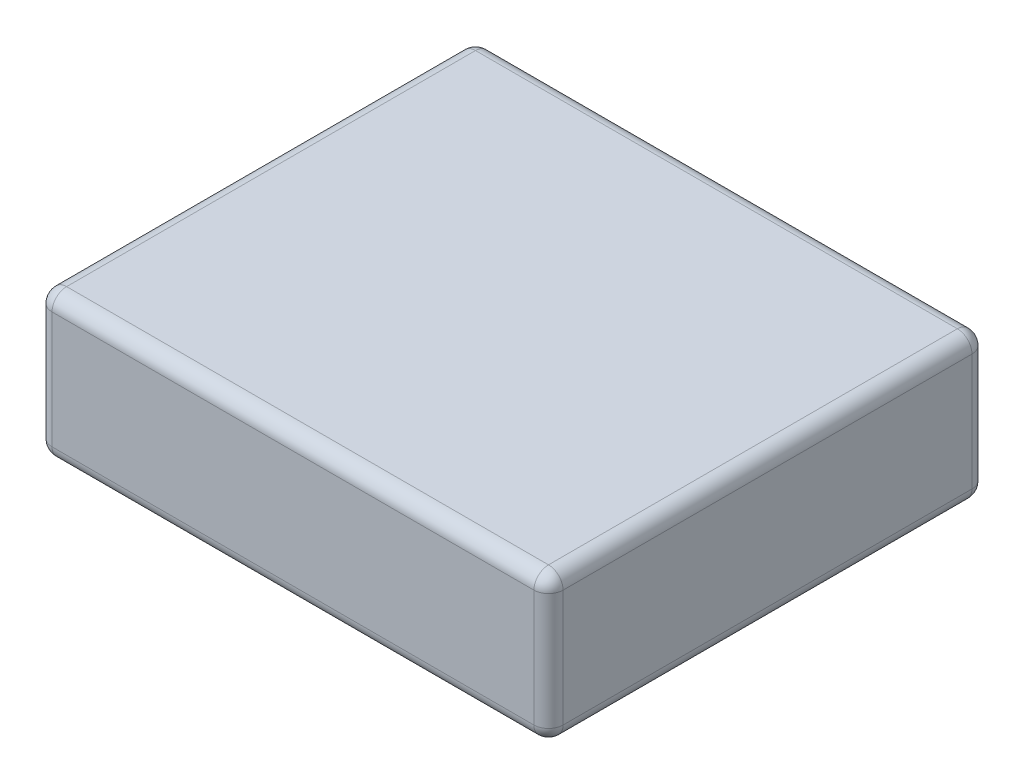
ISO-10303-21;
HEADER;
FILE_DESCRIPTION(('STEP AP214'),'2;1');
FILE_NAME('part.step','',(''),(''),'','','');
FILE_SCHEMA(('AUTOMOTIVE_DESIGN { 1 0 10303 214 1 1 1 1 }'));
ENDSEC;
DATA;
#1=APPLICATION_CONTEXT('core data for automotive mechanical design processes');
#2=APPLICATION_PROTOCOL_DEFINITION('international standard','automotive_design',2000,#1);
#3=PRODUCT_CONTEXT('',#1,'mechanical');
#4=PRODUCT('Part','Part','',(#3));
#5=PRODUCT_RELATED_PRODUCT_CATEGORY('part','',(#4));
#6=PRODUCT_DEFINITION_FORMATION('','',#4);
#7=PRODUCT_DEFINITION_CONTEXT('part definition',#1,'design');
#8=PRODUCT_DEFINITION('design','',#6,#7);
#9=PRODUCT_DEFINITION_SHAPE('','',#8);
#10=(LENGTH_UNIT() NAMED_UNIT(*) SI_UNIT(.MILLI.,.METRE.));
#11=(NAMED_UNIT(*) PLANE_ANGLE_UNIT() SI_UNIT($,.RADIAN.));
#12=(NAMED_UNIT(*) SI_UNIT($,.STERADIAN.) SOLID_ANGLE_UNIT());
#13=UNCERTAINTY_MEASURE_WITH_UNIT(LENGTH_MEASURE(1.E-05),#10,'distance_accuracy_value','');
#14=(GEOMETRIC_REPRESENTATION_CONTEXT(3) GLOBAL_UNCERTAINTY_ASSIGNED_CONTEXT((#13)) GLOBAL_UNIT_ASSIGNED_CONTEXT((#10,
#11,#12)) REPRESENTATION_CONTEXT('',''));
#15=CARTESIAN_POINT('',(0.,0.,0.));
#16=DIRECTION('',(0.,0.,1.));
#17=DIRECTION('',(1.,0.,0.));
#18=AXIS2_PLACEMENT_3D('',#15,#16,#17);
#19=CARTESIAN_POINT('',(36.6442953020134,4.84899328859059,60.));
#20=DIRECTION('',(-1.,0.,0.));
#21=DIRECTION('',(0.,0.,1.));
#22=AXIS2_PLACEMENT_3D('',#19,#20,#21);
#23=PLANE('',#22);
#24=DIRECTION('',(0.,0.,-1.));
#25=VECTOR('',#24,1.);
#26=CARTESIAN_POINT('',(36.6442953020134,-13.1510067114094,60.));
#27=LINE('',#26,#25);
#28=CARTESIAN_POINT('',(36.6442953020134,-13.1510067114094,58.));
#29=VERTEX_POINT('',#28);
#30=CARTESIAN_POINT('',(36.6442953020134,-13.1510067114094,2.));
#31=VERTEX_POINT('',#30);
#32=EDGE_CURVE('E225',#29,#31,#27,.T.);
#33=ORIENTED_EDGE('',*,*,#32,.T.);
#34=DIRECTION('',(0.,1.,0.));
#35=VECTOR('',#34,1.);
#36=CARTESIAN_POINT('',(36.6442953020134,4.84899328859059,2.));
#37=LINE('',#36,#35);
#38=CARTESIAN_POINT('',(36.6442953020134,2.84899328859059,2.));
#39=VERTEX_POINT('',#38);
#40=EDGE_CURVE('E229',#31,#39,#37,.T.);
#41=ORIENTED_EDGE('',*,*,#40,.T.);
#42=DIRECTION('',(0.,0.,-1.));
#43=VECTOR('',#42,1.);
#44=CARTESIAN_POINT('',(36.6442953020134,2.84899328859059,60.));
#45=LINE('',#44,#43);
#46=CARTESIAN_POINT('',(36.6442953020134,2.84899328859059,58.));
#47=VERTEX_POINT('',#46);
#48=EDGE_CURVE('E222',#39,#47,#45,.F.);
#49=ORIENTED_EDGE('',*,*,#48,.T.);
#50=DIRECTION('',(0.,1.,0.));
#51=VECTOR('',#50,1.);
#52=CARTESIAN_POINT('',(36.6442953020134,-15.1510067114094,58.));
#53=LINE('',#52,#51);
#54=EDGE_CURVE('E219',#47,#29,#53,.F.);
#55=ORIENTED_EDGE('',*,*,#54,.T.);
#56=EDGE_LOOP('',(#33,#41,#49,#55));
#57=FACE_BOUND('',#56,.T.);
#58=ADVANCED_FACE('F43',(#57),#23,.F.);
#59=CARTESIAN_POINT('',(-33.3557046979866,4.84899328859059,60.));
#60=DIRECTION('',(0.,-1.,0.));
#61=DIRECTION('',(0.,0.,-1.));
#62=AXIS2_PLACEMENT_3D('',#59,#60,#61);
#63=PLANE('',#62);
#64=DIRECTION('',(-1.,0.,0.));
#65=VECTOR('',#64,1.);
#66=CARTESIAN_POINT('',(-33.3557046979866,4.84899328859059,2.));
#67=LINE('',#66,#65);
#68=CARTESIAN_POINT('',(34.6442953020134,4.84899328859059,2.));
#69=VERTEX_POINT('',#68);
#70=CARTESIAN_POINT('',(-31.3557046979866,4.84899328859059,2.));
#71=VERTEX_POINT('',#70);
#72=EDGE_CURVE('E188',#69,#71,#67,.T.);
#73=ORIENTED_EDGE('',*,*,#72,.T.);
#74=DIRECTION('',(0.,0.,-1.));
#75=VECTOR('',#74,1.);
#76=CARTESIAN_POINT('',(-31.3557046979866,4.84899328859059,60.));
#77=LINE('',#76,#75);
#78=CARTESIAN_POINT('',(-31.3557046979866,4.84899328859059,58.));
#79=VERTEX_POINT('',#78);
#80=EDGE_CURVE('E191',#71,#79,#77,.F.);
#81=ORIENTED_EDGE('',*,*,#80,.T.);
#82=DIRECTION('',(-1.,0.,0.));
#83=VECTOR('',#82,1.);
#84=CARTESIAN_POINT('',(36.6442953020134,4.84899328859059,58.));
#85=LINE('',#84,#83);
#86=CARTESIAN_POINT('',(34.6442953020134,4.84899328859059,58.));
#87=VERTEX_POINT('',#86);
#88=EDGE_CURVE('E182',#79,#87,#85,.F.);
#89=ORIENTED_EDGE('',*,*,#88,.T.);
#90=DIRECTION('',(0.,0.,-1.));
#91=VECTOR('',#90,1.);
#92=CARTESIAN_POINT('',(34.6442953020134,4.84899328859059,60.));
#93=LINE('',#92,#91);
#94=EDGE_CURVE('E185',#87,#69,#93,.T.);
#95=ORIENTED_EDGE('',*,*,#94,.T.);
#96=EDGE_LOOP('',(#73,#81,#89,#95));
#97=FACE_BOUND('',#96,.T.);
#98=ADVANCED_FACE('F363',(#97),#63,.F.);
#99=CARTESIAN_POINT('',(-33.3557046979866,4.84899328859059,60.));
#100=DIRECTION('',(1.,0.,0.));
#101=DIRECTION('',(0.,1.,0.));
#102=AXIS2_PLACEMENT_3D('',#99,#100,#101);
#103=PLANE('',#102);
#104=DIRECTION('',(0.,0.,-1.));
#105=VECTOR('',#104,1.);
#106=CARTESIAN_POINT('',(-33.3557046979866,2.84899328859059,60.));
#107=LINE('',#106,#105);
#108=CARTESIAN_POINT('',(-33.3557046979866,2.84899328859059,58.));
#109=VERTEX_POINT('',#108);
#110=CARTESIAN_POINT('',(-33.3557046979866,2.84899328859059,2.));
#111=VERTEX_POINT('',#110);
#112=EDGE_CURVE('E144',#109,#111,#107,.T.);
#113=ORIENTED_EDGE('',*,*,#112,.T.);
#114=DIRECTION('',(0.,-1.,0.));
#115=VECTOR('',#114,1.);
#116=CARTESIAN_POINT('',(-33.3557046979866,4.84899328859059,2.));
#117=LINE('',#116,#115);
#118=CARTESIAN_POINT('',(-33.3557046979866,-13.1510067114094,2.));
#119=VERTEX_POINT('',#118);
#120=EDGE_CURVE('E139',#111,#119,#117,.T.);
#121=ORIENTED_EDGE('',*,*,#120,.T.);
#122=DIRECTION('',(0.,0.,-1.));
#123=VECTOR('',#122,1.);
#124=CARTESIAN_POINT('',(-33.3557046979866,-13.1510067114094,60.));
#125=LINE('',#124,#123);
#126=CARTESIAN_POINT('',(-33.3557046979866,-13.1510067114094,58.));
#127=VERTEX_POINT('',#126);
#128=EDGE_CURVE('E131',#119,#127,#125,.F.);
#129=ORIENTED_EDGE('',*,*,#128,.T.);
#130=DIRECTION('',(0.,-1.,0.));
#131=VECTOR('',#130,1.);
#132=CARTESIAN_POINT('',(-33.3557046979866,4.84899328859059,58.));
#133=LINE('',#132,#131);
#134=EDGE_CURVE('E136',#127,#109,#133,.F.);
#135=ORIENTED_EDGE('',*,*,#134,.T.);
#136=EDGE_LOOP('',(#113,#121,#129,#135));
#137=FACE_BOUND('',#136,.T.);
#138=ADVANCED_FACE('F134',(#137),#103,.F.);
#139=CARTESIAN_POINT('',(-33.3557046979866,-15.1510067114094,60.));
#140=DIRECTION('',(0.,1.,0.));
#141=DIRECTION('',(0.,0.,1.));
#142=AXIS2_PLACEMENT_3D('',#139,#140,#141);
#143=PLANE('',#142);
#144=DIRECTION('',(1.,0.,0.));
#145=VECTOR('',#144,1.);
#146=CARTESIAN_POINT('',(-33.3557046979866,-15.1510067114094,58.));
#147=LINE('',#146,#145);
#148=CARTESIAN_POINT('',(34.6442953020134,-15.1510067114094,58.));
#149=VERTEX_POINT('',#148);
#150=CARTESIAN_POINT('',(-31.3557046979866,-15.1510067114094,58.));
#151=VERTEX_POINT('',#150);
#152=EDGE_CURVE('E195',#149,#151,#147,.F.);
#153=ORIENTED_EDGE('',*,*,#152,.T.);
#154=DIRECTION('',(0.,0.,-1.));
#155=VECTOR('',#154,1.);
#156=CARTESIAN_POINT('',(-31.3557046979866,-15.1510067114094,60.));
#157=LINE('',#156,#155);
#158=CARTESIAN_POINT('',(-31.3557046979866,-15.1510067114094,2.));
#159=VERTEX_POINT('',#158);
#160=EDGE_CURVE('E152',#151,#159,#157,.T.);
#161=ORIENTED_EDGE('',*,*,#160,.T.);
#162=DIRECTION('',(1.,0.,0.));
#163=VECTOR('',#162,1.);
#164=CARTESIAN_POINT('',(-33.3557046979866,-15.1510067114094,2.));
#165=LINE('',#164,#163);
#166=CARTESIAN_POINT('',(34.6442953020134,-15.1510067114094,2.));
#167=VERTEX_POINT('',#166);
#168=EDGE_CURVE('E201',#159,#167,#165,.T.);
#169=ORIENTED_EDGE('',*,*,#168,.T.);
#170=DIRECTION('',(0.,0.,-1.));
#171=VECTOR('',#170,1.);
#172=CARTESIAN_POINT('',(34.6442953020134,-15.1510067114094,60.));
#173=LINE('',#172,#171);
#174=EDGE_CURVE('E198',#167,#149,#173,.F.);
#175=ORIENTED_EDGE('',*,*,#174,.T.);
#176=EDGE_LOOP('',(#153,#161,#169,#175));
#177=FACE_BOUND('',#176,.T.);
#178=ADVANCED_FACE('F354',(#177),#143,.F.);
#179=CARTESIAN_POINT('',(0.,0.,60.));
#180=DIRECTION('',(0.,0.,1.));
#181=DIRECTION('',(1.,0.,0.));
#182=AXIS2_PLACEMENT_3D('',#179,#180,#181);
#183=PLANE('',#182);
#184=DIRECTION('',(0.,-1.,0.));
#185=VECTOR('',#184,1.);
#186=CARTESIAN_POINT('',(-31.3557046979866,-15.1510067114094,60.));
#187=LINE('',#186,#185);
#188=CARTESIAN_POINT('',(-31.3557046979866,2.84899328859059,60.));
#189=VERTEX_POINT('',#188);
#190=CARTESIAN_POINT('',(-31.3557046979866,-13.1510067114094,60.));
#191=VERTEX_POINT('',#190);
#192=EDGE_CURVE('E53',#189,#191,#187,.T.);
#193=ORIENTED_EDGE('',*,*,#192,.T.);
#194=DIRECTION('',(1.,0.,0.));
#195=VECTOR('',#194,1.);
#196=CARTESIAN_POINT('',(36.6442953020134,-13.1510067114094,60.));
#197=LINE('',#196,#195);
#198=CARTESIAN_POINT('',(34.6442953020134,-13.1510067114094,60.));
#199=VERTEX_POINT('',#198);
#200=EDGE_CURVE('E11',#191,#199,#197,.T.);
#201=ORIENTED_EDGE('',*,*,#200,.T.);
#202=DIRECTION('',(0.,1.,0.));
#203=VECTOR('',#202,1.);
#204=CARTESIAN_POINT('',(34.6442953020134,4.84899328859059,60.));
#205=LINE('',#204,#203);
#206=CARTESIAN_POINT('',(34.6442953020134,2.84899328859059,60.));
#207=VERTEX_POINT('',#206);
#208=EDGE_CURVE('E232',#199,#207,#205,.T.);
#209=ORIENTED_EDGE('',*,*,#208,.T.);
#210=DIRECTION('',(-1.,0.,0.));
#211=VECTOR('',#210,1.);
#212=CARTESIAN_POINT('',(-33.3557046979866,2.84899328859059,60.));
#213=LINE('',#212,#211);
#214=EDGE_CURVE('E64',#207,#189,#213,.T.);
#215=ORIENTED_EDGE('',*,*,#214,.T.);
#216=EDGE_LOOP('',(#193,#201,#209,#215));
#217=FACE_BOUND('',#216,.T.);
#218=ADVANCED_FACE('F356',(#217),#183,.T.);
#219=CARTESIAN_POINT('',(0.,0.,0.));
#220=DIRECTION('',(0.,0.,1.));
#221=DIRECTION('',(1.,0.,0.));
#222=AXIS2_PLACEMENT_3D('',#219,#220,#221);
#223=PLANE('',#222);
#224=DIRECTION('',(0.,-1.,0.));
#225=VECTOR('',#224,1.);
#226=CARTESIAN_POINT('',(-31.3557046979866,0.,0.));
#227=LINE('',#226,#225);
#228=CARTESIAN_POINT('',(-31.3557046979866,-13.1510067114094,0.));
#229=VERTEX_POINT('',#228);
#230=CARTESIAN_POINT('',(-31.3557046979866,2.84899328859059,0.));
#231=VERTEX_POINT('',#230);
#232=EDGE_CURVE('E212',#229,#231,#227,.F.);
#233=ORIENTED_EDGE('',*,*,#232,.T.);
#234=DIRECTION('',(-1.,0.,0.));
#235=VECTOR('',#234,1.);
#236=CARTESIAN_POINT('',(0.,2.84899328859059,0.));
#237=LINE('',#236,#235);
#238=CARTESIAN_POINT('',(34.6442953020134,2.84899328859059,0.));
#239=VERTEX_POINT('',#238);
#240=EDGE_CURVE('E215',#231,#239,#237,.F.);
#241=ORIENTED_EDGE('',*,*,#240,.T.);
#242=DIRECTION('',(0.,1.,0.));
#243=VECTOR('',#242,1.);
#244=CARTESIAN_POINT('',(34.6442953020134,0.,0.));
#245=LINE('',#244,#243);
#246=CARTESIAN_POINT('',(34.6442953020134,-13.1510067114094,0.));
#247=VERTEX_POINT('',#246);
#248=EDGE_CURVE('E206',#239,#247,#245,.F.);
#249=ORIENTED_EDGE('',*,*,#248,.T.);
#250=DIRECTION('',(1.,0.,0.));
#251=VECTOR('',#250,1.);
#252=CARTESIAN_POINT('',(0.,-13.1510067114094,0.));
#253=LINE('',#252,#251);
#254=EDGE_CURVE('E209',#247,#229,#253,.F.);
#255=ORIENTED_EDGE('',*,*,#254,.T.);
#256=EDGE_LOOP('',(#233,#241,#249,#255));
#257=FACE_BOUND('',#256,.T.);
#258=ADVANCED_FACE('F323',(#257),#223,.F.);
#259=CARTESIAN_POINT('',(34.6442953020134,-13.1510067114094,60.));
#260=DIRECTION('',(0.,0.,-1.));
#261=DIRECTION('',(-1.,0.,0.));
#262=AXIS2_PLACEMENT_3D('',#259,#260,#261);
#263=CYLINDRICAL_SURFACE('',#262,2.);
#264=CARTESIAN_POINT('',(34.6442953020134,-13.1510067114094,58.));
#265=DIRECTION('',(0.,0.,1.));
#266=DIRECTION('',(1.,0.,0.));
#267=AXIS2_PLACEMENT_3D('',#264,#265,#266);
#268=CIRCLE('',#267,2.);
#269=EDGE_CURVE('E47',#149,#29,#268,.T.);
#270=ORIENTED_EDGE('',*,*,#269,.F.);
#271=ORIENTED_EDGE('',*,*,#174,.F.);
#272=CARTESIAN_POINT('',(34.6442953020134,-13.1510067114094,2.));
#273=DIRECTION('',(0.,0.,-1.));
#274=DIRECTION('',(-1.,0.,0.));
#275=AXIS2_PLACEMENT_3D('',#272,#273,#274);
#276=CIRCLE('',#275,2.);
#277=EDGE_CURVE('E176',#31,#167,#276,.T.);
#278=ORIENTED_EDGE('',*,*,#277,.F.);
#279=ORIENTED_EDGE('',*,*,#32,.F.);
#280=EDGE_LOOP('',(#270,#271,#278,#279));
#281=FACE_BOUND('',#280,.T.);
#282=ADVANCED_FACE('F45',(#281),#263,.T.);
#283=CARTESIAN_POINT('',(34.6442953020134,-13.1510067114094,58.));
#284=DIRECTION('',(1.,0.,0.));
#285=DIRECTION('',(0.,1.,0.));
#286=AXIS2_PLACEMENT_3D('',#283,#284,#285);
#287=SPHERICAL_SURFACE('',#286,2.);
#288=CARTESIAN_POINT('',(34.6442953020134,-13.1510067114094,58.));
#289=DIRECTION('',(1.,0.,0.));
#290=DIRECTION('',(0.,0.,-1.));
#291=AXIS2_PLACEMENT_3D('',#288,#289,#290);
#292=CIRCLE('',#291,2.);
#293=EDGE_CURVE('E299',#149,#199,#292,.F.);
#294=ORIENTED_EDGE('',*,*,#293,.F.);
#295=ORIENTED_EDGE('',*,*,#269,.T.);
#296=CARTESIAN_POINT('',(34.6442953020134,-13.1510067114094,58.));
#297=DIRECTION('',(0.,-1.,0.));
#298=DIRECTION('',(0.,0.,-1.));
#299=AXIS2_PLACEMENT_3D('',#296,#297,#298);
#300=CIRCLE('',#299,2.);
#301=EDGE_CURVE('E303',#199,#29,#300,.F.);
#302=ORIENTED_EDGE('',*,*,#301,.F.);
#303=EDGE_LOOP('',(#294,#295,#302));
#304=FACE_BOUND('',#303,.T.);
#305=ADVANCED_FACE('F349',(#304),#287,.T.);
#306=CARTESIAN_POINT('',(34.6442953020134,-13.1510067114094,2.));
#307=DIRECTION('',(0.,-1.,0.));
#308=DIRECTION('',(0.,0.,-1.));
#309=AXIS2_PLACEMENT_3D('',#306,#307,#308);
#310=SPHERICAL_SURFACE('',#309,2.);
#311=CARTESIAN_POINT('',(34.6442953020134,-13.1510067114094,2.));
#312=DIRECTION('',(0.,-1.,0.));
#313=DIRECTION('',(1.,0.,0.));
#314=AXIS2_PLACEMENT_3D('',#311,#312,#313);
#315=CIRCLE('',#314,2.);
#316=EDGE_CURVE('E291',#31,#247,#315,.F.);
#317=ORIENTED_EDGE('',*,*,#316,.F.);
#318=ORIENTED_EDGE('',*,*,#277,.T.);
#319=CARTESIAN_POINT('',(34.6442953020134,-13.1510067114094,2.));
#320=DIRECTION('',(1.,0.,0.));
#321=DIRECTION('',(0.,0.,-1.));
#322=AXIS2_PLACEMENT_3D('',#319,#320,#321);
#323=CIRCLE('',#322,2.);
#324=EDGE_CURVE('E295',#247,#167,#323,.F.);
#325=ORIENTED_EDGE('',*,*,#324,.F.);
#326=EDGE_LOOP('',(#317,#318,#325));
#327=FACE_BOUND('',#326,.T.);
#328=ADVANCED_FACE('F312',(#327),#310,.T.);
#329=CARTESIAN_POINT('',(34.6442953020134,0.,58.));
#330=DIRECTION('',(0.,-1.,0.));
#331=DIRECTION('',(0.,0.,-1.));
#332=AXIS2_PLACEMENT_3D('',#329,#330,#331);
#333=CYLINDRICAL_SURFACE('',#332,2.);
#334=ORIENTED_EDGE('',*,*,#301,.T.);
#335=ORIENTED_EDGE('',*,*,#54,.F.);
#336=CARTESIAN_POINT('',(34.6442953020134,2.84899328859059,58.));
#337=DIRECTION('',(0.,1.,0.));
#338=DIRECTION('',(0.,0.,1.));
#339=AXIS2_PLACEMENT_3D('',#336,#337,#338);
#340=CIRCLE('',#339,2.);
#341=EDGE_CURVE('E283',#207,#47,#340,.T.);
#342=ORIENTED_EDGE('',*,*,#341,.F.);
#343=ORIENTED_EDGE('',*,*,#208,.F.);
#344=EDGE_LOOP('',(#334,#335,#342,#343));
#345=FACE_BOUND('',#344,.T.);
#346=ADVANCED_FACE('F344',(#345),#333,.T.);
#347=CARTESIAN_POINT('',(0.,-13.1510067114094,58.));
#348=DIRECTION('',(-1.,0.,0.));
#349=DIRECTION('',(0.,0.,1.));
#350=AXIS2_PLACEMENT_3D('',#347,#348,#349);
#351=CYLINDRICAL_SURFACE('',#350,2.);
#352=ORIENTED_EDGE('',*,*,#293,.T.);
#353=ORIENTED_EDGE('',*,*,#200,.F.);
#354=CARTESIAN_POINT('',(-31.3557046979866,-13.1510067114094,58.));
#355=DIRECTION('',(-1.,0.,0.));
#356=DIRECTION('',(0.,0.,1.));
#357=AXIS2_PLACEMENT_3D('',#354,#355,#356);
#358=CIRCLE('',#357,2.);
#359=EDGE_CURVE('E157',#151,#191,#358,.T.);
#360=ORIENTED_EDGE('',*,*,#359,.F.);
#361=ORIENTED_EDGE('',*,*,#152,.F.);
#362=EDGE_LOOP('',(#352,#353,#360,#361));
#363=FACE_BOUND('',#362,.T.);
#364=ADVANCED_FACE('F352',(#363),#351,.T.);
#365=CARTESIAN_POINT('',(-31.3557046979866,-13.1510067114094,60.));
#366=DIRECTION('',(0.,0.,-1.));
#367=DIRECTION('',(-1.,0.,0.));
#368=AXIS2_PLACEMENT_3D('',#365,#366,#367);
#369=CYLINDRICAL_SURFACE('',#368,2.);
#370=CARTESIAN_POINT('',(-31.3557046979866,-13.1510067114094,2.));
#371=DIRECTION('',(0.,0.,-1.));
#372=DIRECTION('',(-1.,0.,0.));
#373=AXIS2_PLACEMENT_3D('',#370,#371,#372);
#374=CIRCLE('',#373,2.);
#375=EDGE_CURVE('E158',#159,#119,#374,.T.);
#376=ORIENTED_EDGE('',*,*,#375,.F.);
#377=ORIENTED_EDGE('',*,*,#160,.F.);
#378=CARTESIAN_POINT('',(-31.3557046979866,-13.1510067114094,58.));
#379=DIRECTION('',(0.,0.,1.));
#380=DIRECTION('',(1.,0.,0.));
#381=AXIS2_PLACEMENT_3D('',#378,#379,#380);
#382=CIRCLE('',#381,2.);
#383=EDGE_CURVE('E148',#127,#151,#382,.T.);
#384=ORIENTED_EDGE('',*,*,#383,.F.);
#385=ORIENTED_EDGE('',*,*,#128,.F.);
#386=EDGE_LOOP('',(#376,#377,#384,#385));
#387=FACE_BOUND('',#386,.T.);
#388=ADVANCED_FACE('F150',(#387),#369,.T.);
#389=CARTESIAN_POINT('',(-33.3557046979866,-13.1510067114094,2.));
#390=DIRECTION('',(1.,0.,0.));
#391=DIRECTION('',(0.,0.,-1.));
#392=AXIS2_PLACEMENT_3D('',#389,#390,#391);
#393=CYLINDRICAL_SURFACE('',#392,2.);
#394=ORIENTED_EDGE('',*,*,#324,.T.);
#395=ORIENTED_EDGE('',*,*,#168,.F.);
#396=CARTESIAN_POINT('',(-31.3557046979866,-13.1510067114094,2.));
#397=DIRECTION('',(-1.,0.,0.));
#398=DIRECTION('',(0.,0.,1.));
#399=AXIS2_PLACEMENT_3D('',#396,#397,#398);
#400=CIRCLE('',#399,2.);
#401=EDGE_CURVE('E276',#229,#159,#400,.T.);
#402=ORIENTED_EDGE('',*,*,#401,.F.);
#403=ORIENTED_EDGE('',*,*,#254,.F.);
#404=EDGE_LOOP('',(#394,#395,#402,#403));
#405=FACE_BOUND('',#404,.T.);
#406=ADVANCED_FACE('F319',(#405),#393,.T.);
#407=CARTESIAN_POINT('',(34.6442953020134,4.84899328859059,2.));
#408=DIRECTION('',(0.,1.,0.));
#409=DIRECTION('',(0.,0.,1.));
#410=AXIS2_PLACEMENT_3D('',#407,#408,#409);
#411=CYLINDRICAL_SURFACE('',#410,2.);
#412=ORIENTED_EDGE('',*,*,#316,.T.);
#413=ORIENTED_EDGE('',*,*,#248,.F.);
#414=CARTESIAN_POINT('',(34.6442953020134,2.84899328859059,2.));
#415=DIRECTION('',(0.,1.,0.));
#416=DIRECTION('',(0.,0.,1.));
#417=AXIS2_PLACEMENT_3D('',#414,#415,#416);
#418=CIRCLE('',#417,2.);
#419=EDGE_CURVE('E272',#39,#239,#418,.T.);
#420=ORIENTED_EDGE('',*,*,#419,.F.);
#421=ORIENTED_EDGE('',*,*,#40,.F.);
#422=EDGE_LOOP('',(#412,#413,#420,#421));
#423=FACE_BOUND('',#422,.T.);
#424=ADVANCED_FACE('F329',(#423),#411,.T.);
#425=CARTESIAN_POINT('',(34.6442953020134,2.84899328859059,60.));
#426=DIRECTION('',(0.,0.,-1.));
#427=DIRECTION('',(-1.,0.,0.));
#428=AXIS2_PLACEMENT_3D('',#425,#426,#427);
#429=CYLINDRICAL_SURFACE('',#428,2.);
#430=CARTESIAN_POINT('',(34.6442953020134,2.84899328859059,58.));
#431=DIRECTION('',(0.,0.,1.));
#432=DIRECTION('',(1.,0.,0.));
#433=AXIS2_PLACEMENT_3D('',#430,#431,#432);
#434=CIRCLE('',#433,2.);
#435=EDGE_CURVE('E287',#47,#87,#434,.T.);
#436=ORIENTED_EDGE('',*,*,#435,.F.);
#437=ORIENTED_EDGE('',*,*,#48,.F.);
#438=CARTESIAN_POINT('',(34.6442953020134,2.84899328859059,2.));
#439=DIRECTION('',(0.,0.,-1.));
#440=DIRECTION('',(-1.,0.,0.));
#441=AXIS2_PLACEMENT_3D('',#438,#439,#440);
#442=CIRCLE('',#441,2.);
#443=EDGE_CURVE('E268',#69,#39,#442,.T.);
#444=ORIENTED_EDGE('',*,*,#443,.F.);
#445=ORIENTED_EDGE('',*,*,#94,.F.);
#446=EDGE_LOOP('',(#436,#437,#444,#445));
#447=FACE_BOUND('',#446,.T.);
#448=ADVANCED_FACE('F336',(#447),#429,.T.);
#449=CARTESIAN_POINT('',(34.6442953020134,2.84899328859059,58.));
#450=DIRECTION('',(1.,0.,0.));
#451=DIRECTION('',(0.,0.,-1.));
#452=AXIS2_PLACEMENT_3D('',#449,#450,#451);
#453=SPHERICAL_SURFACE('',#452,2.);
#454=ORIENTED_EDGE('',*,*,#341,.T.);
#455=ORIENTED_EDGE('',*,*,#435,.T.);
#456=CARTESIAN_POINT('',(34.6442953020134,2.84899328859059,58.));
#457=DIRECTION('',(1.,0.,0.));
#458=DIRECTION('',(0.,0.,-1.));
#459=AXIS2_PLACEMENT_3D('',#456,#457,#458);
#460=CIRCLE('',#459,2.);
#461=EDGE_CURVE('E165',#207,#87,#460,.F.);
#462=ORIENTED_EDGE('',*,*,#461,.F.);
#463=EDGE_LOOP('',(#454,#455,#462));
#464=FACE_BOUND('',#463,.T.);
#465=ADVANCED_FACE('F342',(#464),#453,.T.);
#466=CARTESIAN_POINT('',(-31.3557046979866,-13.1510067114094,58.));
#467=DIRECTION('',(0.,-1.,0.));
#468=DIRECTION('',(0.,0.,-1.));
#469=AXIS2_PLACEMENT_3D('',#466,#467,#468);
#470=SPHERICAL_SURFACE('',#469,2.);
#471=ORIENTED_EDGE('',*,*,#383,.T.);
#472=ORIENTED_EDGE('',*,*,#359,.T.);
#473=CARTESIAN_POINT('',(-31.3557046979866,-13.1510067114094,58.));
#474=DIRECTION('',(0.,-1.,0.));
#475=DIRECTION('',(0.,0.,-1.));
#476=AXIS2_PLACEMENT_3D('',#473,#474,#475);
#477=CIRCLE('',#476,2.);
#478=EDGE_CURVE('E161',#127,#191,#477,.F.);
#479=ORIENTED_EDGE('',*,*,#478,.F.);
#480=EDGE_LOOP('',(#471,#472,#479));
#481=FACE_BOUND('',#480,.T.);
#482=ADVANCED_FACE('F162',(#481),#470,.T.);
#483=CARTESIAN_POINT('',(-31.3557046979866,-13.1510067114094,2.));
#484=DIRECTION('',(0.,-1.,0.));
#485=DIRECTION('',(0.,0.,-1.));
#486=AXIS2_PLACEMENT_3D('',#483,#484,#485);
#487=SPHERICAL_SURFACE('',#486,2.);
#488=ORIENTED_EDGE('',*,*,#401,.T.);
#489=ORIENTED_EDGE('',*,*,#375,.T.);
#490=CARTESIAN_POINT('',(-31.3557046979866,-13.1510067114094,2.));
#491=DIRECTION('',(0.,-1.,0.));
#492=DIRECTION('',(0.,0.,-1.));
#493=AXIS2_PLACEMENT_3D('',#490,#491,#492);
#494=CIRCLE('',#493,2.);
#495=EDGE_CURVE('E166',#229,#119,#494,.F.);
#496=ORIENTED_EDGE('',*,*,#495,.F.);
#497=EDGE_LOOP('',(#488,#489,#496));
#498=FACE_BOUND('',#497,.T.);
#499=ADVANCED_FACE('F403',(#498),#487,.T.);
#500=CARTESIAN_POINT('',(34.6442953020134,2.84899328859059,2.));
#501=DIRECTION('',(1.,0.,0.));
#502=DIRECTION('',(0.,0.,-1.));
#503=AXIS2_PLACEMENT_3D('',#500,#501,#502);
#504=SPHERICAL_SURFACE('',#503,2.);
#505=ORIENTED_EDGE('',*,*,#443,.T.);
#506=ORIENTED_EDGE('',*,*,#419,.T.);
#507=CARTESIAN_POINT('',(34.6442953020134,2.84899328859059,2.));
#508=DIRECTION('',(1.,0.,0.));
#509=DIRECTION('',(0.,0.,-1.));
#510=AXIS2_PLACEMENT_3D('',#507,#508,#509);
#511=CIRCLE('',#510,2.);
#512=EDGE_CURVE('E259',#69,#239,#511,.F.);
#513=ORIENTED_EDGE('',*,*,#512,.F.);
#514=EDGE_LOOP('',(#505,#506,#513));
#515=FACE_BOUND('',#514,.T.);
#516=ADVANCED_FACE('F399',(#515),#504,.T.);
#517=CARTESIAN_POINT('',(0.,2.84899328859059,58.));
#518=DIRECTION('',(1.,0.,0.));
#519=DIRECTION('',(0.,0.,-1.));
#520=AXIS2_PLACEMENT_3D('',#517,#518,#519);
#521=CYLINDRICAL_SURFACE('',#520,2.);
#522=ORIENTED_EDGE('',*,*,#461,.T.);
#523=ORIENTED_EDGE('',*,*,#88,.F.);
#524=CARTESIAN_POINT('',(-31.3557046979866,2.84899328859059,58.));
#525=DIRECTION('',(-1.,0.,0.));
#526=DIRECTION('',(0.,0.,1.));
#527=AXIS2_PLACEMENT_3D('',#524,#525,#526);
#528=CIRCLE('',#527,2.);
#529=EDGE_CURVE('E255',#189,#79,#528,.T.);
#530=ORIENTED_EDGE('',*,*,#529,.F.);
#531=ORIENTED_EDGE('',*,*,#214,.F.);
#532=EDGE_LOOP('',(#522,#523,#530,#531));
#533=FACE_BOUND('',#532,.T.);
#534=ADVANCED_FACE('F396',(#533),#521,.T.);
#535=CARTESIAN_POINT('',(-31.3557046979866,0.,58.));
#536=DIRECTION('',(0.,1.,0.));
#537=DIRECTION('',(-1.,0.,0.));
#538=AXIS2_PLACEMENT_3D('',#535,#536,#537);
#539=CYLINDRICAL_SURFACE('',#538,2.);
#540=ORIENTED_EDGE('',*,*,#478,.T.);
#541=ORIENTED_EDGE('',*,*,#192,.F.);
#542=CARTESIAN_POINT('',(-31.3557046979866,2.84899328859059,58.));
#543=DIRECTION('',(0.,1.,0.));
#544=DIRECTION('',(-1.,0.,0.));
#545=AXIS2_PLACEMENT_3D('',#542,#543,#544);
#546=CIRCLE('',#545,2.);
#547=EDGE_CURVE('E170',#109,#189,#546,.T.);
#548=ORIENTED_EDGE('',*,*,#547,.F.);
#549=ORIENTED_EDGE('',*,*,#134,.F.);
#550=EDGE_LOOP('',(#540,#541,#548,#549));
#551=FACE_BOUND('',#550,.T.);
#552=ADVANCED_FACE('F168',(#551),#539,.T.);
#553=CARTESIAN_POINT('',(-31.3557046979866,4.84899328859059,2.));
#554=DIRECTION('',(0.,-1.,0.));
#555=DIRECTION('',(1.,0.,0.));
#556=AXIS2_PLACEMENT_3D('',#553,#554,#555);
#557=CYLINDRICAL_SURFACE('',#556,2.);
#558=ORIENTED_EDGE('',*,*,#495,.T.);
#559=ORIENTED_EDGE('',*,*,#120,.F.);
#560=CARTESIAN_POINT('',(-31.3557046979866,2.84899328859059,2.));
#561=DIRECTION('',(0.,1.,0.));
#562=DIRECTION('',(-1.,0.,0.));
#563=AXIS2_PLACEMENT_3D('',#560,#561,#562);
#564=CIRCLE('',#563,2.);
#565=EDGE_CURVE('E249',#231,#111,#564,.T.);
#566=ORIENTED_EDGE('',*,*,#565,.F.);
#567=ORIENTED_EDGE('',*,*,#232,.F.);
#568=EDGE_LOOP('',(#558,#559,#566,#567));
#569=FACE_BOUND('',#568,.T.);
#570=ADVANCED_FACE('F389',(#569),#557,.T.);
#571=CARTESIAN_POINT('',(-33.3557046979866,2.84899328859059,2.));
#572=DIRECTION('',(-1.,0.,0.));
#573=DIRECTION('',(0.,0.,1.));
#574=AXIS2_PLACEMENT_3D('',#571,#572,#573);
#575=CYLINDRICAL_SURFACE('',#574,2.);
#576=ORIENTED_EDGE('',*,*,#512,.T.);
#577=ORIENTED_EDGE('',*,*,#240,.F.);
#578=CARTESIAN_POINT('',(-31.3557046979866,2.84899328859059,2.));
#579=DIRECTION('',(-1.,0.,0.));
#580=DIRECTION('',(0.,0.,1.));
#581=AXIS2_PLACEMENT_3D('',#578,#579,#580);
#582=CIRCLE('',#581,2.);
#583=EDGE_CURVE('E245',#71,#231,#582,.T.);
#584=ORIENTED_EDGE('',*,*,#583,.F.);
#585=ORIENTED_EDGE('',*,*,#72,.F.);
#586=EDGE_LOOP('',(#576,#577,#584,#585));
#587=FACE_BOUND('',#586,.T.);
#588=ADVANCED_FACE('F385',(#587),#575,.T.);
#589=CARTESIAN_POINT('',(-31.3557046979866,2.84899328859059,58.));
#590=DIRECTION('',(0.,0.,1.));
#591=DIRECTION('',(1.,0.,0.));
#592=AXIS2_PLACEMENT_3D('',#589,#590,#591);
#593=SPHERICAL_SURFACE('',#592,2.);
#594=ORIENTED_EDGE('',*,*,#547,.T.);
#595=ORIENTED_EDGE('',*,*,#529,.T.);
#596=CARTESIAN_POINT('',(-31.3557046979866,2.84899328859059,58.));
#597=DIRECTION('',(0.,0.,1.));
#598=DIRECTION('',(1.,0.,0.));
#599=AXIS2_PLACEMENT_3D('',#596,#597,#598);
#600=CIRCLE('',#599,2.);
#601=EDGE_CURVE('E242',#109,#79,#600,.F.);
#602=ORIENTED_EDGE('',*,*,#601,.F.);
#603=EDGE_LOOP('',(#594,#595,#602));
#604=FACE_BOUND('',#603,.T.);
#605=ADVANCED_FACE('F381',(#604),#593,.T.);
#606=CARTESIAN_POINT('',(-31.3557046979866,2.84899328859059,2.));
#607=DIRECTION('',(0.,0.,-1.));
#608=DIRECTION('',(-1.,0.,0.));
#609=AXIS2_PLACEMENT_3D('',#606,#607,#608);
#610=SPHERICAL_SURFACE('',#609,2.);
#611=ORIENTED_EDGE('',*,*,#583,.T.);
#612=ORIENTED_EDGE('',*,*,#565,.T.);
#613=CARTESIAN_POINT('',(-31.3557046979866,2.84899328859059,2.));
#614=DIRECTION('',(0.,0.,-1.));
#615=DIRECTION('',(-1.,0.,0.));
#616=AXIS2_PLACEMENT_3D('',#613,#614,#615);
#617=CIRCLE('',#616,2.);
#618=EDGE_CURVE('E239',#71,#111,#617,.F.);
#619=ORIENTED_EDGE('',*,*,#618,.F.);
#620=EDGE_LOOP('',(#611,#612,#619));
#621=FACE_BOUND('',#620,.T.);
#622=ADVANCED_FACE('F377',(#621),#610,.T.);
#623=CARTESIAN_POINT('',(-31.3557046979866,2.84899328859059,60.));
#624=DIRECTION('',(0.,0.,-1.));
#625=DIRECTION('',(-1.,0.,0.));
#626=AXIS2_PLACEMENT_3D('',#623,#624,#625);
#627=CYLINDRICAL_SURFACE('',#626,2.);
#628=ORIENTED_EDGE('',*,*,#601,.T.);
#629=ORIENTED_EDGE('',*,*,#80,.F.);
#630=ORIENTED_EDGE('',*,*,#618,.T.);
#631=ORIENTED_EDGE('',*,*,#112,.F.);
#632=EDGE_LOOP('',(#628,#629,#630,#631));
#633=FACE_BOUND('',#632,.T.);
#634=ADVANCED_FACE('F374',(#633),#627,.T.);
#635=CLOSED_SHELL('',(#58,#98,#138,#178,#218,#258,#282,#305,#328,#346,#364,#388,#406,#424,#448,
#465,#482,#499,#516,#534,#552,#570,#588,#605,#622,#634));
#636=MANIFOLD_SOLID_BREP('B2',#635);
#637=ADVANCED_BREP_SHAPE_REPRESENTATION('',(#18,#636),#14);
#638=SHAPE_DEFINITION_REPRESENTATION(#9,#637);
ENDSEC;
END-ISO-10303-21;
